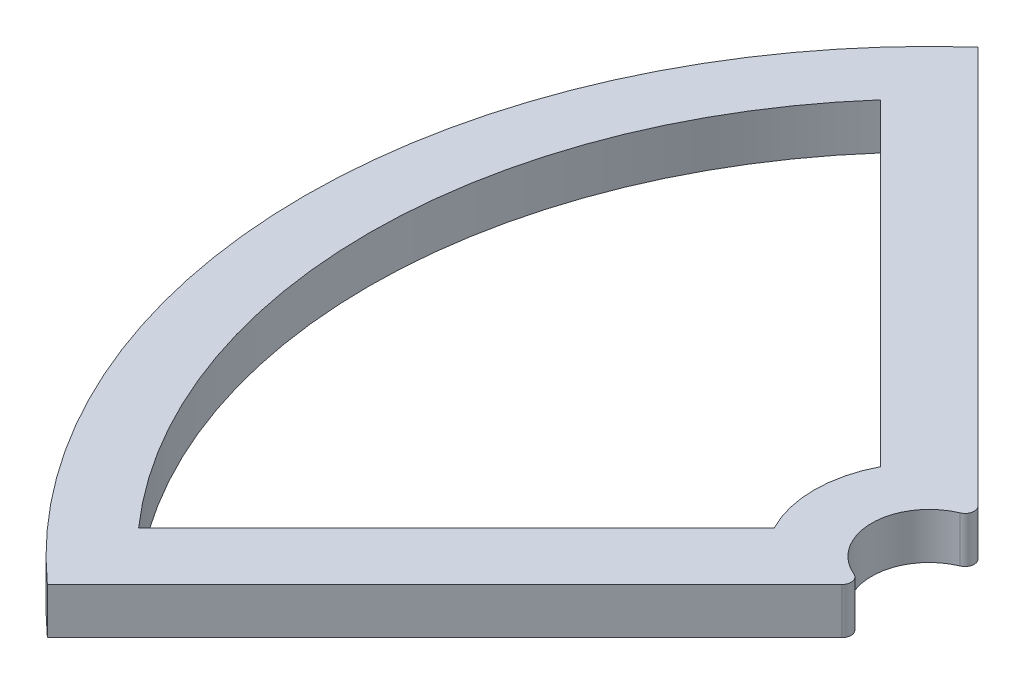
ISO-10303-21;
HEADER;
FILE_DESCRIPTION(('STEP AP214'),'2;1');
FILE_NAME('part.step','',(''),(''),'','','');
FILE_SCHEMA(('AUTOMOTIVE_DESIGN { 1 0 10303 214 1 1 1 1 }'));
ENDSEC;
DATA;
#1=APPLICATION_CONTEXT('core data for automotive mechanical design processes');
#2=APPLICATION_PROTOCOL_DEFINITION('international standard','automotive_design',2000,#1);
#3=PRODUCT_CONTEXT('',#1,'mechanical');
#4=PRODUCT('Part','Part','',(#3));
#5=PRODUCT_RELATED_PRODUCT_CATEGORY('part','',(#4));
#6=PRODUCT_DEFINITION_FORMATION('','',#4);
#7=PRODUCT_DEFINITION_CONTEXT('part definition',#1,'design');
#8=PRODUCT_DEFINITION('design','',#6,#7);
#9=PRODUCT_DEFINITION_SHAPE('','',#8);
#10=(LENGTH_UNIT() NAMED_UNIT(*) SI_UNIT(.MILLI.,.METRE.));
#11=(NAMED_UNIT(*) PLANE_ANGLE_UNIT() SI_UNIT($,.RADIAN.));
#12=(NAMED_UNIT(*) SI_UNIT($,.STERADIAN.) SOLID_ANGLE_UNIT());
#13=UNCERTAINTY_MEASURE_WITH_UNIT(LENGTH_MEASURE(1.E-05),#10,'distance_accuracy_value','');
#14=(GEOMETRIC_REPRESENTATION_CONTEXT(3) GLOBAL_UNCERTAINTY_ASSIGNED_CONTEXT((#13)) GLOBAL_UNIT_ASSIGNED_CONTEXT((#10,
#11,#12)) REPRESENTATION_CONTEXT('',''));
#15=CARTESIAN_POINT('',(0.,0.,0.));
#16=DIRECTION('',(0.,0.,1.));
#17=DIRECTION('',(1.,0.,0.));
#18=AXIS2_PLACEMENT_3D('',#15,#16,#17);
#19=CARTESIAN_POINT('',(-5.59774568397911,10.,-13.3759202770312));
#20=DIRECTION('',(0.,1.,0.));
#21=DIRECTION('',(0.,0.,1.));
#22=AXIS2_PLACEMENT_3D('',#19,#20,#21);
#23=PLANE('',#22);
#24=CARTESIAN_POINT('',(-5.59774568397911,10.,-13.3759202770312));
#25=DIRECTION('',(0.,1.,0.));
#26=DIRECTION('',(0.,0.,1.));
#27=AXIS2_PLACEMENT_3D('',#24,#25,#26);
#28=CIRCLE('',#27,2.);
#29=CARTESIAN_POINT('',(-4.82564283101648,10.,-11.5309657560613));
#30=VERTEX_POINT('',#29);
#31=CARTESIAN_POINT('',(-4.18353212160602,10.,-14.7901338394043));
#32=VERTEX_POINT('',#31);
#33=EDGE_CURVE('E156',#30,#32,#28,.T.);
#34=ORIENTED_EDGE('',*,*,#33,.T.);
#35=DIRECTION('',(-0.707106781186546,0.,-0.707106781186549));
#36=VECTOR('',#35,1.);
#37=CARTESIAN_POINT('',(-4.18353212160602,10.,-14.7901338394043));
#38=LINE('',#37,#36);
#39=CARTESIAN_POINT('',(-90.5398326979706,10.,-101.146434415769));
#40=VERTEX_POINT('',#39);
#41=EDGE_CURVE('E160',#32,#40,#38,.T.);
#42=ORIENTED_EDGE('',*,*,#41,.T.);
#43=CARTESIAN_POINT('',(0.,10.,0.));
#44=DIRECTION('',(0.,1.,0.));
#45=DIRECTION('',(0.,0.,1.));
#46=AXIS2_PLACEMENT_3D('',#43,#44,#45);
#47=CIRCLE('',#46,135.75);
#48=CARTESIAN_POINT('',(-90.5398326979706,10.,101.146434415769));
#49=VERTEX_POINT('',#48);
#50=EDGE_CURVE('E169',#40,#49,#47,.T.);
#51=ORIENTED_EDGE('',*,*,#50,.T.);
#52=DIRECTION('',(0.707106781186546,0.,-0.707106781186549));
#53=VECTOR('',#52,1.);
#54=CARTESIAN_POINT('',(-90.5398326979706,10.,101.146434415769));
#55=LINE('',#54,#53);
#56=CARTESIAN_POINT('',(-4.183532121606,10.,14.7901338394043));
#57=VERTEX_POINT('',#56);
#58=EDGE_CURVE('E171',#49,#57,#55,.T.);
#59=ORIENTED_EDGE('',*,*,#58,.T.);
#60=CARTESIAN_POINT('',(-5.5977456839791,10.,13.3759202770312));
#61=DIRECTION('',(0.,1.,0.));
#62=DIRECTION('',(0.,0.,-1.));
#63=AXIS2_PLACEMENT_3D('',#60,#61,#62);
#64=CIRCLE('',#63,2.);
#65=CARTESIAN_POINT('',(-4.82564283101646,10.,11.5309657560614));
#66=VERTEX_POINT('',#65);
#67=EDGE_CURVE('E174',#57,#66,#64,.T.);
#68=ORIENTED_EDGE('',*,*,#67,.T.);
#69=CARTESIAN_POINT('',(0.,10.,0.));
#70=DIRECTION('',(0.,-1.,0.));
#71=DIRECTION('',(0.,0.,1.));
#72=AXIS2_PLACEMENT_3D('',#69,#70,#71);
#73=CIRCLE('',#72,12.5);
#74=EDGE_CURVE('E176',#66,#30,#73,.T.);
#75=ORIENTED_EDGE('',*,*,#74,.T.);
#76=EDGE_LOOP('',(#34,#42,#51,#59,#68,#75));
#77=FACE_BOUND('',#76,.T.);
#78=DIRECTION('',(-0.707106781186547,0.,-0.707106781186549));
#79=VECTOR('',#78,1.);
#80=CARTESIAN_POINT('',(-22.1667228129391,10.,-11.560121095141));
#81=LINE('',#80,#79);
#82=CARTESIAN_POINT('',(-22.1667228129391,10.,-11.560121095141));
#83=VERTEX_POINT('',#82);
#84=CARTESIAN_POINT('',(-91.2300501864512,10.,-80.6234484686533));
#85=VERTEX_POINT('',#84);
#86=EDGE_CURVE('E120',#83,#85,#81,.T.);
#87=ORIENTED_EDGE('',*,*,#86,.F.);
#88=CARTESIAN_POINT('',(0.,10.,0.));
#89=DIRECTION('',(0.,-1.,0.));
#90=DIRECTION('',(0.,0.,1.));
#91=AXIS2_PLACEMENT_3D('',#88,#89,#90);
#92=CIRCLE('',#91,25.);
#93=CARTESIAN_POINT('',(-22.1667228129391,10.,11.560121095141));
#94=VERTEX_POINT('',#93);
#95=EDGE_CURVE('E112',#94,#83,#92,.T.);
#96=ORIENTED_EDGE('',*,*,#95,.F.);
#97=DIRECTION('',(0.707106781186546,0.,-0.707106781186549));
#98=VECTOR('',#97,1.);
#99=CARTESIAN_POINT('',(-91.2300501864512,10.,80.6234484686533));
#100=LINE('',#99,#98);
#101=CARTESIAN_POINT('',(-91.2300501864512,10.,80.6234484686533));
#102=VERTEX_POINT('',#101);
#103=EDGE_CURVE('E134',#102,#94,#100,.T.);
#104=ORIENTED_EDGE('',*,*,#103,.F.);
#105=CARTESIAN_POINT('',(0.,10.,0.));
#106=DIRECTION('',(0.,1.,0.));
#107=DIRECTION('',(0.,0.,1.));
#108=AXIS2_PLACEMENT_3D('',#105,#106,#107);
#109=CIRCLE('',#108,121.75);
#110=EDGE_CURVE('E132',#85,#102,#109,.T.);
#111=ORIENTED_EDGE('',*,*,#110,.F.);
#112=EDGE_LOOP('',(#87,#96,#104,#111));
#113=FACE_BOUND('',#112,.T.);
#114=ADVANCED_FACE('F35',(#77,#113),#23,.T.);
#115=CARTESIAN_POINT('',(-5.59774568397911,0.,-13.3759202770312));
#116=DIRECTION('',(0.,1.,0.));
#117=DIRECTION('',(0.,0.,1.));
#118=AXIS2_PLACEMENT_3D('',#115,#116,#117);
#119=PLANE('',#118);
#120=CARTESIAN_POINT('',(-5.59774568397911,0.,-13.3759202770312));
#121=DIRECTION('',(0.,1.,0.));
#122=DIRECTION('',(0.,0.,1.));
#123=AXIS2_PLACEMENT_3D('',#120,#121,#122);
#124=CIRCLE('',#123,2.);
#125=CARTESIAN_POINT('',(-4.82564283101648,0.,-11.5309657560613));
#126=VERTEX_POINT('',#125);
#127=CARTESIAN_POINT('',(-4.18353212160602,0.,-14.7901338394043));
#128=VERTEX_POINT('',#127);
#129=EDGE_CURVE('E128',#126,#128,#124,.T.);
#130=ORIENTED_EDGE('',*,*,#129,.F.);
#131=CARTESIAN_POINT('',(0.,0.,0.));
#132=DIRECTION('',(0.,-1.,0.));
#133=DIRECTION('',(0.,0.,1.));
#134=AXIS2_PLACEMENT_3D('',#131,#132,#133);
#135=CIRCLE('',#134,12.5);
#136=CARTESIAN_POINT('',(-4.82564283101646,0.,11.5309657560614));
#137=VERTEX_POINT('',#136);
#138=EDGE_CURVE('E161',#137,#126,#135,.T.);
#139=ORIENTED_EDGE('',*,*,#138,.F.);
#140=CARTESIAN_POINT('',(-5.5977456839791,0.,13.3759202770312));
#141=DIRECTION('',(0.,1.,0.));
#142=DIRECTION('',(0.,0.,-1.));
#143=AXIS2_PLACEMENT_3D('',#140,#141,#142);
#144=CIRCLE('',#143,2.);
#145=CARTESIAN_POINT('',(-4.183532121606,0.,14.7901338394043));
#146=VERTEX_POINT('',#145);
#147=EDGE_CURVE('E188',#146,#137,#144,.T.);
#148=ORIENTED_EDGE('',*,*,#147,.F.);
#149=DIRECTION('',(0.707106781186546,0.,-0.707106781186549));
#150=VECTOR('',#149,1.);
#151=CARTESIAN_POINT('',(-90.5398326979706,0.,101.146434415769));
#152=LINE('',#151,#150);
#153=CARTESIAN_POINT('',(-90.5398326979706,0.,101.146434415769));
#154=VERTEX_POINT('',#153);
#155=EDGE_CURVE('E186',#154,#146,#152,.T.);
#156=ORIENTED_EDGE('',*,*,#155,.F.);
#157=CARTESIAN_POINT('',(0.,0.,0.));
#158=DIRECTION('',(0.,1.,0.));
#159=DIRECTION('',(0.,0.,1.));
#160=AXIS2_PLACEMENT_3D('',#157,#158,#159);
#161=CIRCLE('',#160,135.75);
#162=CARTESIAN_POINT('',(-90.5398326979706,0.,-101.146434415769));
#163=VERTEX_POINT('',#162);
#164=EDGE_CURVE('E184',#163,#154,#161,.T.);
#165=ORIENTED_EDGE('',*,*,#164,.F.);
#166=DIRECTION('',(-0.707106781186546,0.,-0.707106781186549));
#167=VECTOR('',#166,1.);
#168=CARTESIAN_POINT('',(-4.18353212160602,0.,-14.7901338394043));
#169=LINE('',#168,#167);
#170=EDGE_CURVE('E182',#128,#163,#169,.T.);
#171=ORIENTED_EDGE('',*,*,#170,.F.);
#172=EDGE_LOOP('',(#130,#139,#148,#156,#165,#171));
#173=FACE_BOUND('',#172,.T.);
#174=CARTESIAN_POINT('',(0.,0.,0.));
#175=DIRECTION('',(0.,-1.,0.));
#176=DIRECTION('',(0.,0.,1.));
#177=AXIS2_PLACEMENT_3D('',#174,#175,#176);
#178=CIRCLE('',#177,25.);
#179=CARTESIAN_POINT('',(-22.1667228129391,0.,11.560121095141));
#180=VERTEX_POINT('',#179);
#181=CARTESIAN_POINT('',(-22.1667228129391,0.,-11.560121095141));
#182=VERTEX_POINT('',#181);
#183=EDGE_CURVE('E58',#180,#182,#178,.T.);
#184=ORIENTED_EDGE('',*,*,#183,.T.);
#185=DIRECTION('',(-0.707106781186547,0.,-0.707106781186549));
#186=VECTOR('',#185,1.);
#187=CARTESIAN_POINT('',(-22.1667228129391,0.,-11.560121095141));
#188=LINE('',#187,#186);
#189=CARTESIAN_POINT('',(-91.2300501864512,0.,-80.6234484686533));
#190=VERTEX_POINT('',#189);
#191=EDGE_CURVE('E127',#182,#190,#188,.T.);
#192=ORIENTED_EDGE('',*,*,#191,.T.);
#193=CARTESIAN_POINT('',(0.,0.,0.));
#194=DIRECTION('',(0.,1.,0.));
#195=DIRECTION('',(0.,0.,1.));
#196=AXIS2_PLACEMENT_3D('',#193,#194,#195);
#197=CIRCLE('',#196,121.75);
#198=CARTESIAN_POINT('',(-91.2300501864512,0.,80.6234484686533));
#199=VERTEX_POINT('',#198);
#200=EDGE_CURVE('E148',#190,#199,#197,.T.);
#201=ORIENTED_EDGE('',*,*,#200,.T.);
#202=DIRECTION('',(0.707106781186546,0.,-0.707106781186549));
#203=VECTOR('',#202,1.);
#204=CARTESIAN_POINT('',(-91.2300501864512,0.,80.6234484686533));
#205=LINE('',#204,#203);
#206=EDGE_CURVE('E121',#199,#180,#205,.T.);
#207=ORIENTED_EDGE('',*,*,#206,.T.);
#208=EDGE_LOOP('',(#184,#192,#201,#207));
#209=FACE_BOUND('',#208,.T.);
#210=ADVANCED_FACE('F212',(#173,#209),#119,.F.);
#211=CARTESIAN_POINT('',(-5.59774568397911,10.,-13.3759202770312));
#212=DIRECTION('',(0.,-1.,0.));
#213=DIRECTION('',(0.,0.,-1.));
#214=AXIS2_PLACEMENT_3D('',#211,#212,#213);
#215=CYLINDRICAL_SURFACE('',#214,2.);
#216=ORIENTED_EDGE('',*,*,#129,.T.);
#217=DIRECTION('',(0.,-1.,0.));
#218=VECTOR('',#217,1.);
#219=CARTESIAN_POINT('',(-4.18353212160602,10.,-14.7901338394043));
#220=LINE('',#219,#218);
#221=EDGE_CURVE('E12',#32,#128,#220,.T.);
#222=ORIENTED_EDGE('',*,*,#221,.F.);
#223=ORIENTED_EDGE('',*,*,#33,.F.);
#224=DIRECTION('',(0.,-1.,0.));
#225=VECTOR('',#224,1.);
#226=CARTESIAN_POINT('',(-4.82564283101648,10.,-11.5309657560613));
#227=LINE('',#226,#225);
#228=EDGE_CURVE('E179',#30,#126,#227,.T.);
#229=ORIENTED_EDGE('',*,*,#228,.T.);
#230=EDGE_LOOP('',(#216,#222,#223,#229));
#231=FACE_BOUND('',#230,.T.);
#232=ADVANCED_FACE('F37',(#231),#215,.T.);
#233=CARTESIAN_POINT('',(-4.18353212160602,10.,-14.7901338394043));
#234=DIRECTION('',(-0.707106781186549,0.,0.707106781186546));
#235=DIRECTION('',(0.707106781186546,0.,0.707106781186549));
#236=AXIS2_PLACEMENT_3D('',#233,#234,#235);
#237=PLANE('',#236);
#238=ORIENTED_EDGE('',*,*,#170,.T.);
#239=DIRECTION('',(0.,-1.,0.));
#240=VECTOR('',#239,1.);
#241=CARTESIAN_POINT('',(-90.5398326979706,10.,-101.146434415769));
#242=LINE('',#241,#240);
#243=EDGE_CURVE('E43',#40,#163,#242,.T.);
#244=ORIENTED_EDGE('',*,*,#243,.F.);
#245=ORIENTED_EDGE('',*,*,#41,.F.);
#246=ORIENTED_EDGE('',*,*,#221,.T.);
#247=EDGE_LOOP('',(#238,#244,#245,#246));
#248=FACE_BOUND('',#247,.T.);
#249=ADVANCED_FACE('F229',(#248),#237,.F.);
#250=CARTESIAN_POINT('',(0.,10.,0.));
#251=DIRECTION('',(0.,-1.,0.));
#252=DIRECTION('',(0.,0.,-1.));
#253=AXIS2_PLACEMENT_3D('',#250,#251,#252);
#254=CYLINDRICAL_SURFACE('',#253,135.75);
#255=ORIENTED_EDGE('',*,*,#164,.T.);
#256=DIRECTION('',(0.,-1.,0.));
#257=VECTOR('',#256,1.);
#258=CARTESIAN_POINT('',(-90.5398326979706,10.,101.146434415769));
#259=LINE('',#258,#257);
#260=EDGE_CURVE('E199',#49,#154,#259,.T.);
#261=ORIENTED_EDGE('',*,*,#260,.F.);
#262=ORIENTED_EDGE('',*,*,#50,.F.);
#263=ORIENTED_EDGE('',*,*,#243,.T.);
#264=EDGE_LOOP('',(#255,#261,#262,#263));
#265=FACE_BOUND('',#264,.T.);
#266=ADVANCED_FACE('F206',(#265),#254,.T.);
#267=CARTESIAN_POINT('',(-90.5398326979706,10.,101.146434415769));
#268=DIRECTION('',(-0.707106781186549,0.,-0.707106781186546));
#269=DIRECTION('',(-0.707106781186546,0.,0.707106781186549));
#270=AXIS2_PLACEMENT_3D('',#267,#268,#269);
#271=PLANE('',#270);
#272=ORIENTED_EDGE('',*,*,#155,.T.);
#273=DIRECTION('',(0.,-1.,0.));
#274=VECTOR('',#273,1.);
#275=CARTESIAN_POINT('',(-4.183532121606,10.,14.7901338394043));
#276=LINE('',#275,#274);
#277=EDGE_CURVE('E196',#57,#146,#276,.T.);
#278=ORIENTED_EDGE('',*,*,#277,.F.);
#279=ORIENTED_EDGE('',*,*,#58,.F.);
#280=ORIENTED_EDGE('',*,*,#260,.T.);
#281=EDGE_LOOP('',(#272,#278,#279,#280));
#282=FACE_BOUND('',#281,.T.);
#283=ADVANCED_FACE('F218',(#282),#271,.F.);
#284=CARTESIAN_POINT('',(-5.5977456839791,10.,13.3759202770312));
#285=DIRECTION('',(0.,-1.,0.));
#286=DIRECTION('',(0.,0.,-1.));
#287=AXIS2_PLACEMENT_3D('',#284,#285,#286);
#288=CYLINDRICAL_SURFACE('',#287,2.);
#289=ORIENTED_EDGE('',*,*,#147,.T.);
#290=DIRECTION('',(0.,-1.,0.));
#291=VECTOR('',#290,1.);
#292=CARTESIAN_POINT('',(-4.82564283101646,10.,11.5309657560614));
#293=LINE('',#292,#291);
#294=EDGE_CURVE('E193',#66,#137,#293,.T.);
#295=ORIENTED_EDGE('',*,*,#294,.F.);
#296=ORIENTED_EDGE('',*,*,#67,.F.);
#297=ORIENTED_EDGE('',*,*,#277,.T.);
#298=EDGE_LOOP('',(#289,#295,#296,#297));
#299=FACE_BOUND('',#298,.T.);
#300=ADVANCED_FACE('F222',(#299),#288,.T.);
#301=CARTESIAN_POINT('',(0.,10.,0.));
#302=DIRECTION('',(0.,-1.,0.));
#303=DIRECTION('',(0.,0.,-1.));
#304=AXIS2_PLACEMENT_3D('',#301,#302,#303);
#305=CYLINDRICAL_SURFACE('',#304,12.5);
#306=ORIENTED_EDGE('',*,*,#138,.T.);
#307=ORIENTED_EDGE('',*,*,#228,.F.);
#308=ORIENTED_EDGE('',*,*,#74,.F.);
#309=ORIENTED_EDGE('',*,*,#294,.T.);
#310=EDGE_LOOP('',(#306,#307,#308,#309));
#311=FACE_BOUND('',#310,.T.);
#312=ADVANCED_FACE('F232',(#311),#305,.F.);
#313=CARTESIAN_POINT('',(0.,10.,0.));
#314=DIRECTION('',(0.,-1.,0.));
#315=DIRECTION('',(0.,0.,-1.));
#316=AXIS2_PLACEMENT_3D('',#313,#314,#315);
#317=CYLINDRICAL_SURFACE('',#316,25.);
#318=ORIENTED_EDGE('',*,*,#183,.F.);
#319=DIRECTION('',(0.,-1.,0.));
#320=VECTOR('',#319,1.);
#321=CARTESIAN_POINT('',(-22.1667228129391,10.,11.560121095141));
#322=LINE('',#321,#320);
#323=EDGE_CURVE('E116',#94,#180,#322,.T.);
#324=ORIENTED_EDGE('',*,*,#323,.F.);
#325=ORIENTED_EDGE('',*,*,#95,.T.);
#326=DIRECTION('',(0.,-1.,0.));
#327=VECTOR('',#326,1.);
#328=CARTESIAN_POINT('',(-22.1667228129391,10.,-11.560121095141));
#329=LINE('',#328,#327);
#330=EDGE_CURVE('E115',#83,#182,#329,.T.);
#331=ORIENTED_EDGE('',*,*,#330,.T.);
#332=EDGE_LOOP('',(#318,#324,#325,#331));
#333=FACE_BOUND('',#332,.T.);
#334=ADVANCED_FACE('F114',(#333),#317,.T.);
#335=CARTESIAN_POINT('',(-22.1667228129391,10.,-11.560121095141));
#336=DIRECTION('',(-0.707106781186549,0.,0.707106781186547));
#337=DIRECTION('',(0.707106781186547,0.,0.707106781186549));
#338=AXIS2_PLACEMENT_3D('',#335,#336,#337);
#339=PLANE('',#338);
#340=ORIENTED_EDGE('',*,*,#191,.F.);
#341=ORIENTED_EDGE('',*,*,#330,.F.);
#342=ORIENTED_EDGE('',*,*,#86,.T.);
#343=DIRECTION('',(0.,-1.,0.));
#344=VECTOR('',#343,1.);
#345=CARTESIAN_POINT('',(-91.2300501864512,10.,-80.6234484686533));
#346=LINE('',#345,#344);
#347=EDGE_CURVE('E129',#85,#190,#346,.T.);
#348=ORIENTED_EDGE('',*,*,#347,.T.);
#349=EDGE_LOOP('',(#340,#341,#342,#348));
#350=FACE_BOUND('',#349,.T.);
#351=ADVANCED_FACE('F124',(#350),#339,.T.);
#352=CARTESIAN_POINT('',(0.,10.,0.));
#353=DIRECTION('',(0.,-1.,0.));
#354=DIRECTION('',(0.,0.,-1.));
#355=AXIS2_PLACEMENT_3D('',#352,#353,#354);
#356=CYLINDRICAL_SURFACE('',#355,121.75);
#357=ORIENTED_EDGE('',*,*,#200,.F.);
#358=ORIENTED_EDGE('',*,*,#347,.F.);
#359=ORIENTED_EDGE('',*,*,#110,.T.);
#360=DIRECTION('',(0.,-1.,0.));
#361=VECTOR('',#360,1.);
#362=CARTESIAN_POINT('',(-91.2300501864512,10.,80.6234484686533));
#363=LINE('',#362,#361);
#364=EDGE_CURVE('E50',#102,#199,#363,.T.);
#365=ORIENTED_EDGE('',*,*,#364,.T.);
#366=EDGE_LOOP('',(#357,#358,#359,#365));
#367=FACE_BOUND('',#366,.T.);
#368=ADVANCED_FACE('F250',(#367),#356,.F.);
#369=CARTESIAN_POINT('',(-91.2300501864512,10.,80.6234484686533));
#370=DIRECTION('',(-0.707106781186549,0.,-0.707106781186546));
#371=DIRECTION('',(-0.707106781186546,0.,0.707106781186549));
#372=AXIS2_PLACEMENT_3D('',#369,#370,#371);
#373=PLANE('',#372);
#374=ORIENTED_EDGE('',*,*,#206,.F.);
#375=ORIENTED_EDGE('',*,*,#364,.F.);
#376=ORIENTED_EDGE('',*,*,#103,.T.);
#377=ORIENTED_EDGE('',*,*,#323,.T.);
#378=EDGE_LOOP('',(#374,#375,#376,#377));
#379=FACE_BOUND('',#378,.T.);
#380=ADVANCED_FACE('F253',(#379),#373,.T.);
#381=CLOSED_SHELL('',(#114,#210,#232,#249,#266,#283,#300,#312,#334,#351,#368,#380));
#382=MANIFOLD_SOLID_BREP('B2',#381);
#383=ADVANCED_BREP_SHAPE_REPRESENTATION('',(#18,#382),#14);
#384=SHAPE_DEFINITION_REPRESENTATION(#9,#383);
ENDSEC;
END-ISO-10303-21;
